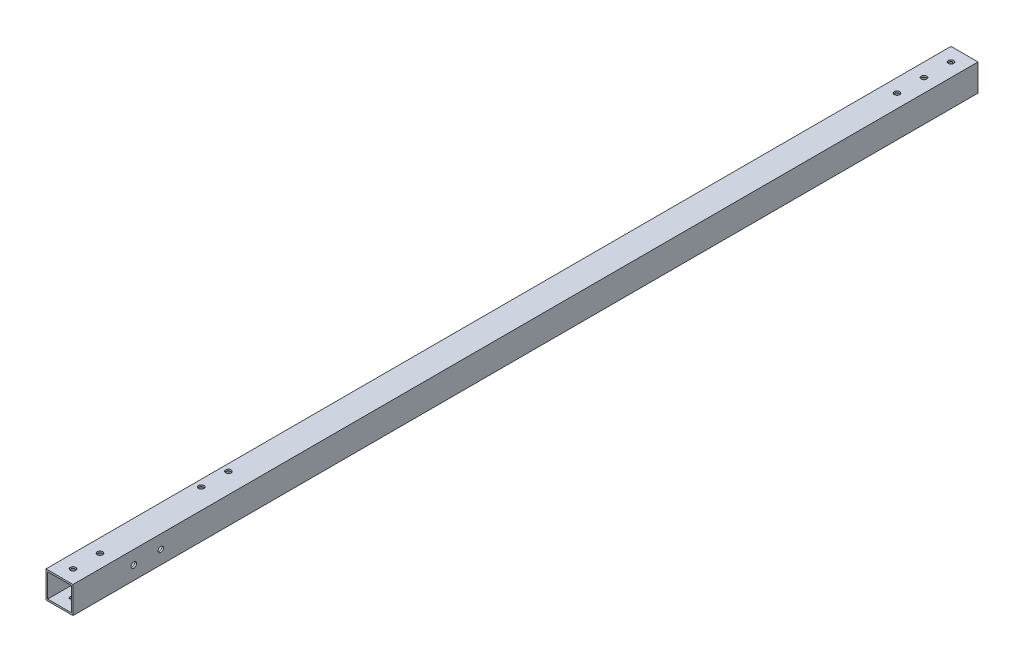
ISO-10303-21;
HEADER;
FILE_DESCRIPTION(('STEP AP214'),'2;1');
FILE_NAME('part.step','',(''),(''),'','','');
FILE_SCHEMA(('AUTOMOTIVE_DESIGN { 1 0 10303 214 1 1 1 1 }'));
ENDSEC;
DATA;
#1=APPLICATION_CONTEXT('core data for automotive mechanical design processes');
#2=APPLICATION_PROTOCOL_DEFINITION('international standard','automotive_design',2000,#1);
#3=PRODUCT_CONTEXT('',#1,'mechanical');
#4=PRODUCT('Part','Part','',(#3));
#5=PRODUCT_RELATED_PRODUCT_CATEGORY('part','',(#4));
#6=PRODUCT_DEFINITION_FORMATION('','',#4);
#7=PRODUCT_DEFINITION_CONTEXT('part definition',#1,'design');
#8=PRODUCT_DEFINITION('design','',#6,#7);
#9=PRODUCT_DEFINITION_SHAPE('','',#8);
#10=(LENGTH_UNIT() NAMED_UNIT(*) SI_UNIT(.MILLI.,.METRE.));
#11=(NAMED_UNIT(*) PLANE_ANGLE_UNIT() SI_UNIT($,.RADIAN.));
#12=(NAMED_UNIT(*) SI_UNIT($,.STERADIAN.) SOLID_ANGLE_UNIT());
#13=UNCERTAINTY_MEASURE_WITH_UNIT(LENGTH_MEASURE(1.E-05),#10,'distance_accuracy_value','');
#14=(GEOMETRIC_REPRESENTATION_CONTEXT(3) GLOBAL_UNCERTAINTY_ASSIGNED_CONTEXT((#13)) GLOBAL_UNIT_ASSIGNED_CONTEXT((#10,
#11,#12)) REPRESENTATION_CONTEXT('',''));
#15=CARTESIAN_POINT('',(0.,0.,0.));
#16=DIRECTION('',(0.,0.,1.));
#17=DIRECTION('',(1.,0.,0.));
#18=AXIS2_PLACEMENT_3D('',#15,#16,#17);
#19=CARTESIAN_POINT('',(0.,0.,850.9));
#20=DIRECTION('',(0.,0.,-1.));
#21=DIRECTION('',(-1.,0.,0.));
#22=AXIS2_PLACEMENT_3D('',#19,#20,#21);
#23=PLANE('',#22);
#24=DIRECTION('',(0.,-1.,0.));
#25=VECTOR('',#24,1.);
#26=CARTESIAN_POINT('',(0.,0.,850.9));
#27=LINE('',#26,#25);
#28=CARTESIAN_POINT('',(0.,25.4,850.9));
#29=VERTEX_POINT('',#28);
#30=CARTESIAN_POINT('',(0.,0.,850.9));
#31=VERTEX_POINT('',#30);
#32=EDGE_CURVE('E157',#29,#31,#27,.T.);
#33=ORIENTED_EDGE('',*,*,#32,.T.);
#34=DIRECTION('',(1.,0.,0.));
#35=VECTOR('',#34,1.);
#36=CARTESIAN_POINT('',(0.,0.,850.9));
#37=LINE('',#36,#35);
#38=CARTESIAN_POINT('',(25.4,0.,850.9));
#39=VERTEX_POINT('',#38);
#40=EDGE_CURVE('E161',#31,#39,#37,.T.);
#41=ORIENTED_EDGE('',*,*,#40,.T.);
#42=DIRECTION('',(0.,1.,0.));
#43=VECTOR('',#42,1.);
#44=CARTESIAN_POINT('',(25.4,0.,850.9));
#45=LINE('',#44,#43);
#46=CARTESIAN_POINT('',(25.4,25.4,850.9));
#47=VERTEX_POINT('',#46);
#48=EDGE_CURVE('E165',#39,#47,#45,.T.);
#49=ORIENTED_EDGE('',*,*,#48,.T.);
#50=DIRECTION('',(-1.,0.,0.));
#51=VECTOR('',#50,1.);
#52=CARTESIAN_POINT('',(0.,25.4,850.9));
#53=LINE('',#52,#51);
#54=EDGE_CURVE('E168',#47,#29,#53,.T.);
#55=ORIENTED_EDGE('',*,*,#54,.T.);
#56=EDGE_LOOP('',(#33,#41,#49,#55));
#57=FACE_BOUND('',#56,.T.);
#58=DIRECTION('',(0.,-1.,0.));
#59=VECTOR('',#58,1.);
#60=CARTESIAN_POINT('',(1.5875,1.5875,850.9));
#61=LINE('',#60,#59);
#62=CARTESIAN_POINT('',(1.5875,23.8125,850.9));
#63=VERTEX_POINT('',#62);
#64=CARTESIAN_POINT('',(1.5875,1.5875,850.9));
#65=VERTEX_POINT('',#64);
#66=EDGE_CURVE('E107',#63,#65,#61,.T.);
#67=ORIENTED_EDGE('',*,*,#66,.F.);
#68=DIRECTION('',(-1.,0.,0.));
#69=VECTOR('',#68,1.);
#70=CARTESIAN_POINT('',(1.5875,23.8125,850.9));
#71=LINE('',#70,#69);
#72=CARTESIAN_POINT('',(23.8125,23.8125,850.9));
#73=VERTEX_POINT('',#72);
#74=EDGE_CURVE('E133',#73,#63,#71,.T.);
#75=ORIENTED_EDGE('',*,*,#74,.F.);
#76=DIRECTION('',(0.,1.,0.));
#77=VECTOR('',#76,1.);
#78=CARTESIAN_POINT('',(23.8125,1.5875,850.9));
#79=LINE('',#78,#77);
#80=CARTESIAN_POINT('',(23.8125,1.5875,850.9));
#81=VERTEX_POINT('',#80);
#82=EDGE_CURVE('E129',#81,#73,#79,.T.);
#83=ORIENTED_EDGE('',*,*,#82,.F.);
#84=DIRECTION('',(1.,0.,0.));
#85=VECTOR('',#84,1.);
#86=CARTESIAN_POINT('',(1.5875,1.5875,850.9));
#87=LINE('',#86,#85);
#88=EDGE_CURVE('E116',#65,#81,#87,.T.);
#89=ORIENTED_EDGE('',*,*,#88,.F.);
#90=EDGE_LOOP('',(#67,#75,#83,#89));
#91=FACE_BOUND('',#90,.T.);
#92=ADVANCED_FACE('F39',(#57,#91),#23,.F.);
#93=CARTESIAN_POINT('',(0.,0.,0.));
#94=DIRECTION('',(0.,0.,-1.));
#95=DIRECTION('',(-1.,0.,0.));
#96=AXIS2_PLACEMENT_3D('',#93,#94,#95);
#97=PLANE('',#96);
#98=DIRECTION('',(0.,-1.,0.));
#99=VECTOR('',#98,1.);
#100=CARTESIAN_POINT('',(0.,0.,0.));
#101=LINE('',#100,#99);
#102=CARTESIAN_POINT('',(0.,25.4,0.));
#103=VERTEX_POINT('',#102);
#104=CARTESIAN_POINT('',(0.,0.,0.));
#105=VERTEX_POINT('',#104);
#106=EDGE_CURVE('E125',#103,#105,#101,.T.);
#107=ORIENTED_EDGE('',*,*,#106,.F.);
#108=DIRECTION('',(-1.,0.,0.));
#109=VECTOR('',#108,1.);
#110=CARTESIAN_POINT('',(0.,25.4,0.));
#111=LINE('',#110,#109);
#112=CARTESIAN_POINT('',(25.4,25.4,0.));
#113=VERTEX_POINT('',#112);
#114=EDGE_CURVE('E162',#113,#103,#111,.T.);
#115=ORIENTED_EDGE('',*,*,#114,.F.);
#116=DIRECTION('',(0.,1.,0.));
#117=VECTOR('',#116,1.);
#118=CARTESIAN_POINT('',(25.4,0.,0.));
#119=LINE('',#118,#117);
#120=CARTESIAN_POINT('',(25.4,0.,0.));
#121=VERTEX_POINT('',#120);
#122=EDGE_CURVE('E178',#121,#113,#119,.T.);
#123=ORIENTED_EDGE('',*,*,#122,.F.);
#124=DIRECTION('',(1.,0.,0.));
#125=VECTOR('',#124,1.);
#126=CARTESIAN_POINT('',(0.,0.,0.));
#127=LINE('',#126,#125);
#128=EDGE_CURVE('E175',#105,#121,#127,.T.);
#129=ORIENTED_EDGE('',*,*,#128,.F.);
#130=EDGE_LOOP('',(#107,#115,#123,#129));
#131=FACE_BOUND('',#130,.T.);
#132=DIRECTION('',(-1.,0.,0.));
#133=VECTOR('',#132,1.);
#134=CARTESIAN_POINT('',(1.5875,23.8125,0.));
#135=LINE('',#134,#133);
#136=CARTESIAN_POINT('',(23.8125,23.8125,0.));
#137=VERTEX_POINT('',#136);
#138=CARTESIAN_POINT('',(1.5875,23.8125,0.));
#139=VERTEX_POINT('',#138);
#140=EDGE_CURVE('E117',#137,#139,#135,.T.);
#141=ORIENTED_EDGE('',*,*,#140,.T.);
#142=DIRECTION('',(0.,-1.,0.));
#143=VECTOR('',#142,1.);
#144=CARTESIAN_POINT('',(1.5875,1.5875,0.));
#145=LINE('',#144,#143);
#146=CARTESIAN_POINT('',(1.5875,1.5875,0.));
#147=VERTEX_POINT('',#146);
#148=EDGE_CURVE('E65',#139,#147,#145,.T.);
#149=ORIENTED_EDGE('',*,*,#148,.T.);
#150=DIRECTION('',(1.,0.,0.));
#151=VECTOR('',#150,1.);
#152=CARTESIAN_POINT('',(1.5875,1.5875,0.));
#153=LINE('',#152,#151);
#154=CARTESIAN_POINT('',(23.8125,1.5875,0.));
#155=VERTEX_POINT('',#154);
#156=EDGE_CURVE('E123',#147,#155,#153,.T.);
#157=ORIENTED_EDGE('',*,*,#156,.T.);
#158=DIRECTION('',(0.,1.,0.));
#159=VECTOR('',#158,1.);
#160=CARTESIAN_POINT('',(23.8125,1.5875,0.));
#161=LINE('',#160,#159);
#162=EDGE_CURVE('E144',#155,#137,#161,.T.);
#163=ORIENTED_EDGE('',*,*,#162,.T.);
#164=EDGE_LOOP('',(#141,#149,#157,#163));
#165=FACE_BOUND('',#164,.T.);
#166=ADVANCED_FACE('F377',(#131,#165),#97,.T.);
#167=CARTESIAN_POINT('',(0.,0.,850.9));
#168=DIRECTION('',(1.,0.,0.));
#169=DIRECTION('',(0.,0.,-1.));
#170=AXIS2_PLACEMENT_3D('',#167,#168,#169);
#171=PLANE('',#170);
#172=CARTESIAN_POINT('',(0.,12.7,793.75));
#173=DIRECTION('',(1.,0.,0.));
#174=DIRECTION('',(0.,0.,-1.));
#175=AXIS2_PLACEMENT_3D('',#172,#173,#174);
#176=CIRCLE('',#175,2.53999999999996);
#177=CARTESIAN_POINT('',(0.,12.7,791.21));
#178=VERTEX_POINT('',#177);
#179=EDGE_CURVE('E231',#178,#178,#176,.T.);
#180=ORIENTED_EDGE('',*,*,#179,.T.);
#181=EDGE_LOOP('',(#180));
#182=FACE_BOUND('',#181,.T.);
#183=CARTESIAN_POINT('',(0.,12.7,768.35));
#184=DIRECTION('',(1.,0.,0.));
#185=DIRECTION('',(0.,0.,-1.));
#186=AXIS2_PLACEMENT_3D('',#183,#184,#185);
#187=CIRCLE('',#186,2.53999999999996);
#188=CARTESIAN_POINT('',(0.,12.7,765.81));
#189=VERTEX_POINT('',#188);
#190=EDGE_CURVE('E245',#189,#189,#187,.T.);
#191=ORIENTED_EDGE('',*,*,#190,.T.);
#192=EDGE_LOOP('',(#191));
#193=FACE_BOUND('',#192,.T.);
#194=ORIENTED_EDGE('',*,*,#106,.T.);
#195=DIRECTION('',(0.,0.,-1.));
#196=VECTOR('',#195,1.);
#197=CARTESIAN_POINT('',(0.,0.,850.9));
#198=LINE('',#197,#196);
#199=EDGE_CURVE('E11',#31,#105,#198,.T.);
#200=ORIENTED_EDGE('',*,*,#199,.F.);
#201=ORIENTED_EDGE('',*,*,#32,.F.);
#202=DIRECTION('',(0.,0.,-1.));
#203=VECTOR('',#202,1.);
#204=CARTESIAN_POINT('',(0.,25.4,850.9));
#205=LINE('',#204,#203);
#206=EDGE_CURVE('E171',#29,#103,#205,.T.);
#207=ORIENTED_EDGE('',*,*,#206,.T.);
#208=EDGE_LOOP('',(#194,#200,#201,#207));
#209=FACE_BOUND('',#208,.T.);
#210=ADVANCED_FACE('F41',(#182,#193,#209),#171,.F.);
#211=CARTESIAN_POINT('',(0.,0.,850.9));
#212=DIRECTION('',(0.,1.,0.));
#213=DIRECTION('',(0.,0.,1.));
#214=AXIS2_PLACEMENT_3D('',#211,#212,#213);
#215=PLANE('',#214);
#216=CARTESIAN_POINT('',(6.35,0.,685.8));
#217=DIRECTION('',(0.,1.,0.));
#218=DIRECTION('',(0.,0.,1.));
#219=AXIS2_PLACEMENT_3D('',#216,#217,#218);
#220=CIRCLE('',#219,2.53999999999989);
#221=CARTESIAN_POINT('',(6.35,0.,688.34));
#222=VERTEX_POINT('',#221);
#223=EDGE_CURVE('E301',#222,#222,#220,.T.);
#224=ORIENTED_EDGE('',*,*,#223,.T.);
#225=EDGE_LOOP('',(#224));
#226=FACE_BOUND('',#225,.T.);
#227=CARTESIAN_POINT('',(6.35,0.,711.2));
#228=DIRECTION('',(0.,1.,0.));
#229=DIRECTION('',(0.,0.,1.));
#230=AXIS2_PLACEMENT_3D('',#227,#228,#229);
#231=CIRCLE('',#230,2.5399999999999);
#232=CARTESIAN_POINT('',(6.35,0.,713.74));
#233=VERTEX_POINT('',#232);
#234=EDGE_CURVE('E293',#233,#233,#231,.T.);
#235=ORIENTED_EDGE('',*,*,#234,.T.);
#236=EDGE_LOOP('',(#235));
#237=FACE_BOUND('',#236,.T.);
#238=CARTESIAN_POINT('',(12.7,0.,838.2));
#239=DIRECTION('',(0.,1.,0.));
#240=DIRECTION('',(0.,0.,-1.));
#241=AXIS2_PLACEMENT_3D('',#238,#239,#240);
#242=CIRCLE('',#241,2.53999999999991);
#243=CARTESIAN_POINT('',(12.7,0.,835.66));
#244=VERTEX_POINT('',#243);
#245=EDGE_CURVE('E285',#244,#244,#242,.T.);
#246=ORIENTED_EDGE('',*,*,#245,.T.);
#247=EDGE_LOOP('',(#246));
#248=FACE_BOUND('',#247,.T.);
#249=CARTESIAN_POINT('',(12.7,0.,63.5));
#250=DIRECTION('',(0.,1.,0.));
#251=DIRECTION('',(0.,0.,1.));
#252=AXIS2_PLACEMENT_3D('',#249,#250,#251);
#253=CIRCLE('',#252,2.54);
#254=CARTESIAN_POINT('',(12.7,0.,66.04));
#255=VERTEX_POINT('',#254);
#256=EDGE_CURVE('E277',#255,#255,#253,.T.);
#257=ORIENTED_EDGE('',*,*,#256,.T.);
#258=EDGE_LOOP('',(#257));
#259=FACE_BOUND('',#258,.T.);
#260=CARTESIAN_POINT('',(12.7,0.,38.1));
#261=DIRECTION('',(0.,1.,0.));
#262=DIRECTION('',(0.,0.,1.));
#263=AXIS2_PLACEMENT_3D('',#260,#261,#262);
#264=CIRCLE('',#263,2.54);
#265=CARTESIAN_POINT('',(12.7,0.,40.64));
#266=VERTEX_POINT('',#265);
#267=EDGE_CURVE('E269',#266,#266,#264,.T.);
#268=ORIENTED_EDGE('',*,*,#267,.T.);
#269=EDGE_LOOP('',(#268));
#270=FACE_BOUND('',#269,.T.);
#271=CARTESIAN_POINT('',(12.7,0.,12.7));
#272=DIRECTION('',(0.,1.,0.));
#273=DIRECTION('',(0.,0.,1.));
#274=AXIS2_PLACEMENT_3D('',#271,#272,#273);
#275=CIRCLE('',#274,2.54);
#276=CARTESIAN_POINT('',(12.7,0.,15.24));
#277=VERTEX_POINT('',#276);
#278=EDGE_CURVE('E260',#277,#277,#275,.T.);
#279=ORIENTED_EDGE('',*,*,#278,.T.);
#280=EDGE_LOOP('',(#279));
#281=FACE_BOUND('',#280,.T.);
#282=CARTESIAN_POINT('',(12.7,0.,812.8));
#283=DIRECTION('',(0.,1.,0.));
#284=DIRECTION('',(0.,0.,-1.));
#285=AXIS2_PLACEMENT_3D('',#282,#283,#284);
#286=CIRCLE('',#285,2.5399999999999);
#287=CARTESIAN_POINT('',(12.7,0.,810.26));
#288=VERTEX_POINT('',#287);
#289=EDGE_CURVE('E198',#288,#288,#286,.T.);
#290=ORIENTED_EDGE('',*,*,#289,.T.);
#291=EDGE_LOOP('',(#290));
#292=FACE_BOUND('',#291,.T.);
#293=ORIENTED_EDGE('',*,*,#128,.T.);
#294=DIRECTION('',(0.,0.,-1.));
#295=VECTOR('',#294,1.);
#296=CARTESIAN_POINT('',(25.4,0.,850.9));
#297=LINE('',#296,#295);
#298=EDGE_CURVE('E49',#39,#121,#297,.T.);
#299=ORIENTED_EDGE('',*,*,#298,.F.);
#300=ORIENTED_EDGE('',*,*,#40,.F.);
#301=ORIENTED_EDGE('',*,*,#199,.T.);
#302=EDGE_LOOP('',(#293,#299,#300,#301));
#303=FACE_BOUND('',#302,.T.);
#304=ADVANCED_FACE('F363',(#226,#237,#248,#259,#270,#281,#292,#303),#215,.F.);
#305=CARTESIAN_POINT('',(25.4,0.,850.9));
#306=DIRECTION('',(-1.,0.,0.));
#307=DIRECTION('',(0.,0.,1.));
#308=AXIS2_PLACEMENT_3D('',#305,#306,#307);
#309=PLANE('',#308);
#310=CARTESIAN_POINT('',(25.4,12.7,793.75));
#311=DIRECTION('',(1.,0.,0.));
#312=DIRECTION('',(0.,0.,-1.));
#313=AXIS2_PLACEMENT_3D('',#310,#311,#312);
#314=CIRCLE('',#313,2.53999999999996);
#315=CARTESIAN_POINT('',(25.4,12.7,791.21));
#316=VERTEX_POINT('',#315);
#317=EDGE_CURVE('E239',#316,#316,#314,.T.);
#318=ORIENTED_EDGE('',*,*,#317,.F.);
#319=EDGE_LOOP('',(#318));
#320=FACE_BOUND('',#319,.T.);
#321=CARTESIAN_POINT('',(25.4,12.7,768.35));
#322=DIRECTION('',(1.,0.,0.));
#323=DIRECTION('',(0.,0.,-1.));
#324=AXIS2_PLACEMENT_3D('',#321,#322,#323);
#325=CIRCLE('',#324,2.53999999999996);
#326=CARTESIAN_POINT('',(25.4,12.7,765.81));
#327=VERTEX_POINT('',#326);
#328=EDGE_CURVE('E251',#327,#327,#325,.T.);
#329=ORIENTED_EDGE('',*,*,#328,.F.);
#330=EDGE_LOOP('',(#329));
#331=FACE_BOUND('',#330,.T.);
#332=ORIENTED_EDGE('',*,*,#122,.T.);
#333=DIRECTION('',(0.,0.,-1.));
#334=VECTOR('',#333,1.);
#335=CARTESIAN_POINT('',(25.4,25.4,850.9));
#336=LINE('',#335,#334);
#337=EDGE_CURVE('E186',#47,#113,#336,.T.);
#338=ORIENTED_EDGE('',*,*,#337,.F.);
#339=ORIENTED_EDGE('',*,*,#48,.F.);
#340=ORIENTED_EDGE('',*,*,#298,.T.);
#341=EDGE_LOOP('',(#332,#338,#339,#340));
#342=FACE_BOUND('',#341,.T.);
#343=ADVANCED_FACE('F366',(#320,#331,#342),#309,.F.);
#344=CARTESIAN_POINT('',(0.,25.4,850.9));
#345=DIRECTION('',(0.,-1.,0.));
#346=DIRECTION('',(0.,0.,-1.));
#347=AXIS2_PLACEMENT_3D('',#344,#345,#346);
#348=PLANE('',#347);
#349=CARTESIAN_POINT('',(6.35,25.4,685.8));
#350=DIRECTION('',(0.,1.,0.));
#351=DIRECTION('',(0.,0.,1.));
#352=AXIS2_PLACEMENT_3D('',#349,#350,#351);
#353=CIRCLE('',#352,2.53999999999989);
#354=CARTESIAN_POINT('',(6.35,25.4,688.34));
#355=VERTEX_POINT('',#354);
#356=EDGE_CURVE('E259',#355,#355,#353,.T.);
#357=ORIENTED_EDGE('',*,*,#356,.F.);
#358=EDGE_LOOP('',(#357));
#359=FACE_BOUND('',#358,.T.);
#360=CARTESIAN_POINT('',(6.35,25.4,711.2));
#361=DIRECTION('',(0.,1.,0.));
#362=DIRECTION('',(0.,0.,1.));
#363=AXIS2_PLACEMENT_3D('',#360,#361,#362);
#364=CIRCLE('',#363,2.5399999999999);
#365=CARTESIAN_POINT('',(6.35,25.4,713.74));
#366=VERTEX_POINT('',#365);
#367=EDGE_CURVE('E297',#366,#366,#364,.T.);
#368=ORIENTED_EDGE('',*,*,#367,.F.);
#369=EDGE_LOOP('',(#368));
#370=FACE_BOUND('',#369,.T.);
#371=CARTESIAN_POINT('',(12.7,25.4,838.2));
#372=DIRECTION('',(0.,1.,0.));
#373=DIRECTION('',(0.,0.,-1.));
#374=AXIS2_PLACEMENT_3D('',#371,#372,#373);
#375=CIRCLE('',#374,2.53999999999991);
#376=CARTESIAN_POINT('',(12.7,25.4,835.66));
#377=VERTEX_POINT('',#376);
#378=EDGE_CURVE('E289',#377,#377,#375,.T.);
#379=ORIENTED_EDGE('',*,*,#378,.F.);
#380=EDGE_LOOP('',(#379));
#381=FACE_BOUND('',#380,.T.);
#382=CARTESIAN_POINT('',(12.7,25.4,63.5));
#383=DIRECTION('',(0.,1.,0.));
#384=DIRECTION('',(0.,0.,1.));
#385=AXIS2_PLACEMENT_3D('',#382,#383,#384);
#386=CIRCLE('',#385,2.54);
#387=CARTESIAN_POINT('',(12.7,25.4,66.04));
#388=VERTEX_POINT('',#387);
#389=EDGE_CURVE('E281',#388,#388,#386,.T.);
#390=ORIENTED_EDGE('',*,*,#389,.F.);
#391=EDGE_LOOP('',(#390));
#392=FACE_BOUND('',#391,.T.);
#393=CARTESIAN_POINT('',(12.7,25.4,38.1));
#394=DIRECTION('',(0.,1.,0.));
#395=DIRECTION('',(0.,0.,1.));
#396=AXIS2_PLACEMENT_3D('',#393,#394,#395);
#397=CIRCLE('',#396,2.54);
#398=CARTESIAN_POINT('',(12.7,25.4,40.64));
#399=VERTEX_POINT('',#398);
#400=EDGE_CURVE('E273',#399,#399,#397,.T.);
#401=ORIENTED_EDGE('',*,*,#400,.F.);
#402=EDGE_LOOP('',(#401));
#403=FACE_BOUND('',#402,.T.);
#404=CARTESIAN_POINT('',(12.7,25.4,12.7));
#405=DIRECTION('',(0.,1.,0.));
#406=DIRECTION('',(0.,0.,1.));
#407=AXIS2_PLACEMENT_3D('',#404,#405,#406);
#408=CIRCLE('',#407,2.54);
#409=CARTESIAN_POINT('',(12.7,25.4,15.24));
#410=VERTEX_POINT('',#409);
#411=EDGE_CURVE('E265',#410,#410,#408,.T.);
#412=ORIENTED_EDGE('',*,*,#411,.F.);
#413=EDGE_LOOP('',(#412));
#414=FACE_BOUND('',#413,.T.);
#415=CARTESIAN_POINT('',(12.7,25.4,812.8));
#416=DIRECTION('',(0.,1.,0.));
#417=DIRECTION('',(0.,0.,-1.));
#418=AXIS2_PLACEMENT_3D('',#415,#416,#417);
#419=CIRCLE('',#418,2.5399999999999);
#420=CARTESIAN_POINT('',(12.7,25.4,810.26));
#421=VERTEX_POINT('',#420);
#422=EDGE_CURVE('E264',#421,#421,#419,.T.);
#423=ORIENTED_EDGE('',*,*,#422,.F.);
#424=EDGE_LOOP('',(#423));
#425=FACE_BOUND('',#424,.T.);
#426=ORIENTED_EDGE('',*,*,#114,.T.);
#427=ORIENTED_EDGE('',*,*,#206,.F.);
#428=ORIENTED_EDGE('',*,*,#54,.F.);
#429=ORIENTED_EDGE('',*,*,#337,.T.);
#430=EDGE_LOOP('',(#426,#427,#428,#429));
#431=FACE_BOUND('',#430,.T.);
#432=ADVANCED_FACE('F381',(#359,#370,#381,#392,#403,#414,#425,#431),#348,.F.);
#433=CARTESIAN_POINT('',(1.5875,1.5875,850.9));
#434=DIRECTION('',(1.,0.,0.));
#435=DIRECTION('',(0.,0.,-1.));
#436=AXIS2_PLACEMENT_3D('',#433,#434,#435);
#437=PLANE('',#436);
#438=CARTESIAN_POINT('',(1.5875,12.7,793.75));
#439=DIRECTION('',(1.,0.,0.));
#440=DIRECTION('',(0.,0.,-1.));
#441=AXIS2_PLACEMENT_3D('',#438,#439,#440);
#442=CIRCLE('',#441,2.53999999999996);
#443=CARTESIAN_POINT('',(1.5875,12.7,791.21));
#444=VERTEX_POINT('',#443);
#445=EDGE_CURVE('E255',#444,#444,#442,.T.);
#446=ORIENTED_EDGE('',*,*,#445,.F.);
#447=EDGE_LOOP('',(#446));
#448=FACE_BOUND('',#447,.T.);
#449=CARTESIAN_POINT('',(1.5875,12.7,768.35));
#450=DIRECTION('',(1.,0.,0.));
#451=DIRECTION('',(0.,0.,-1.));
#452=AXIS2_PLACEMENT_3D('',#449,#450,#451);
#453=CIRCLE('',#452,2.53999999999996);
#454=CARTESIAN_POINT('',(1.5875,12.7,765.81));
#455=VERTEX_POINT('',#454);
#456=EDGE_CURVE('E230',#455,#455,#453,.T.);
#457=ORIENTED_EDGE('',*,*,#456,.F.);
#458=EDGE_LOOP('',(#457));
#459=FACE_BOUND('',#458,.T.);
#460=ORIENTED_EDGE('',*,*,#148,.F.);
#461=DIRECTION('',(0.,0.,-1.));
#462=VECTOR('',#461,1.);
#463=CARTESIAN_POINT('',(1.5875,23.8125,850.9));
#464=LINE('',#463,#462);
#465=EDGE_CURVE('E111',#63,#139,#464,.T.);
#466=ORIENTED_EDGE('',*,*,#465,.F.);
#467=ORIENTED_EDGE('',*,*,#66,.T.);
#468=DIRECTION('',(0.,0.,-1.));
#469=VECTOR('',#468,1.);
#470=CARTESIAN_POINT('',(1.5875,1.5875,850.9));
#471=LINE('',#470,#469);
#472=EDGE_CURVE('E110',#65,#147,#471,.T.);
#473=ORIENTED_EDGE('',*,*,#472,.T.);
#474=EDGE_LOOP('',(#460,#466,#467,#473));
#475=FACE_BOUND('',#474,.T.);
#476=ADVANCED_FACE('F109',(#448,#459,#475),#437,.T.);
#477=CARTESIAN_POINT('',(1.5875,1.5875,850.9));
#478=DIRECTION('',(0.,1.,0.));
#479=DIRECTION('',(0.,0.,1.));
#480=AXIS2_PLACEMENT_3D('',#477,#478,#479);
#481=PLANE('',#480);
#482=CARTESIAN_POINT('',(6.35,1.5875,685.8));
#483=DIRECTION('',(0.,1.,0.));
#484=DIRECTION('',(0.,0.,1.));
#485=AXIS2_PLACEMENT_3D('',#482,#483,#484);
#486=CIRCLE('',#485,2.53999999999989);
#487=CARTESIAN_POINT('',(6.35,1.5875,688.34));
#488=VERTEX_POINT('',#487);
#489=EDGE_CURVE('E141',#488,#488,#486,.T.);
#490=ORIENTED_EDGE('',*,*,#489,.F.);
#491=EDGE_LOOP('',(#490));
#492=FACE_BOUND('',#491,.T.);
#493=CARTESIAN_POINT('',(6.35,1.5875,711.2));
#494=DIRECTION('',(0.,1.,0.));
#495=DIRECTION('',(0.,0.,1.));
#496=AXIS2_PLACEMENT_3D('',#493,#494,#495);
#497=CIRCLE('',#496,2.5399999999999);
#498=CARTESIAN_POINT('',(6.35,1.5875,713.74));
#499=VERTEX_POINT('',#498);
#500=EDGE_CURVE('E223',#499,#499,#497,.T.);
#501=ORIENTED_EDGE('',*,*,#500,.F.);
#502=EDGE_LOOP('',(#501));
#503=FACE_BOUND('',#502,.T.);
#504=CARTESIAN_POINT('',(12.7,1.5875,838.2));
#505=DIRECTION('',(0.,1.,0.));
#506=DIRECTION('',(0.,0.,1.));
#507=AXIS2_PLACEMENT_3D('',#504,#505,#506);
#508=CIRCLE('',#507,2.53999999999991);
#509=CARTESIAN_POINT('',(12.7,1.5875,840.74));
#510=VERTEX_POINT('',#509);
#511=EDGE_CURVE('E218',#510,#510,#508,.T.);
#512=ORIENTED_EDGE('',*,*,#511,.F.);
#513=EDGE_LOOP('',(#512));
#514=FACE_BOUND('',#513,.T.);
#515=CARTESIAN_POINT('',(12.7,1.5875,63.5));
#516=DIRECTION('',(0.,1.,0.));
#517=DIRECTION('',(0.,0.,1.));
#518=AXIS2_PLACEMENT_3D('',#515,#516,#517);
#519=CIRCLE('',#518,2.54);
#520=CARTESIAN_POINT('',(12.7,1.5875,66.04));
#521=VERTEX_POINT('',#520);
#522=EDGE_CURVE('E213',#521,#521,#519,.T.);
#523=ORIENTED_EDGE('',*,*,#522,.F.);
#524=EDGE_LOOP('',(#523));
#525=FACE_BOUND('',#524,.T.);
#526=CARTESIAN_POINT('',(12.7,1.5875,38.1));
#527=DIRECTION('',(0.,1.,0.));
#528=DIRECTION('',(0.,0.,1.));
#529=AXIS2_PLACEMENT_3D('',#526,#527,#528);
#530=CIRCLE('',#529,2.54);
#531=CARTESIAN_POINT('',(12.7,1.5875,40.64));
#532=VERTEX_POINT('',#531);
#533=EDGE_CURVE('E208',#532,#532,#530,.T.);
#534=ORIENTED_EDGE('',*,*,#533,.F.);
#535=EDGE_LOOP('',(#534));
#536=FACE_BOUND('',#535,.T.);
#537=CARTESIAN_POINT('',(12.7,1.5875,12.7));
#538=DIRECTION('',(0.,1.,0.));
#539=DIRECTION('',(0.,0.,1.));
#540=AXIS2_PLACEMENT_3D('',#537,#538,#539);
#541=CIRCLE('',#540,2.54);
#542=CARTESIAN_POINT('',(12.7,1.5875,15.24));
#543=VERTEX_POINT('',#542);
#544=EDGE_CURVE('E203',#543,#543,#541,.T.);
#545=ORIENTED_EDGE('',*,*,#544,.F.);
#546=EDGE_LOOP('',(#545));
#547=FACE_BOUND('',#546,.T.);
#548=CARTESIAN_POINT('',(12.7,1.5875,812.8));
#549=DIRECTION('',(0.,1.,0.));
#550=DIRECTION('',(0.,0.,1.));
#551=AXIS2_PLACEMENT_3D('',#548,#549,#550);
#552=CIRCLE('',#551,2.5399999999999);
#553=CARTESIAN_POINT('',(12.7,1.5875,815.34));
#554=VERTEX_POINT('',#553);
#555=EDGE_CURVE('E197',#554,#554,#552,.T.);
#556=ORIENTED_EDGE('',*,*,#555,.F.);
#557=EDGE_LOOP('',(#556));
#558=FACE_BOUND('',#557,.T.);
#559=ORIENTED_EDGE('',*,*,#156,.F.);
#560=ORIENTED_EDGE('',*,*,#472,.F.);
#561=ORIENTED_EDGE('',*,*,#88,.T.);
#562=DIRECTION('',(0.,0.,-1.));
#563=VECTOR('',#562,1.);
#564=CARTESIAN_POINT('',(23.8125,1.5875,850.9));
#565=LINE('',#564,#563);
#566=EDGE_CURVE('E126',#81,#155,#565,.T.);
#567=ORIENTED_EDGE('',*,*,#566,.T.);
#568=EDGE_LOOP('',(#559,#560,#561,#567));
#569=FACE_BOUND('',#568,.T.);
#570=ADVANCED_FACE('F120',(#492,#503,#514,#525,#536,#547,#558,#569),#481,.T.);
#571=CARTESIAN_POINT('',(23.8125,1.5875,850.9));
#572=DIRECTION('',(-1.,0.,0.));
#573=DIRECTION('',(0.,0.,1.));
#574=AXIS2_PLACEMENT_3D('',#571,#572,#573);
#575=PLANE('',#574);
#576=CARTESIAN_POINT('',(23.8125,12.7,793.75));
#577=DIRECTION('',(-1.,0.,0.));
#578=DIRECTION('',(0.,0.,1.));
#579=AXIS2_PLACEMENT_3D('',#576,#577,#578);
#580=CIRCLE('',#579,2.53999999999996);
#581=CARTESIAN_POINT('',(23.8125,12.7,796.29));
#582=VERTEX_POINT('',#581);
#583=EDGE_CURVE('E43',#582,#582,#580,.T.);
#584=ORIENTED_EDGE('',*,*,#583,.F.);
#585=EDGE_LOOP('',(#584));
#586=FACE_BOUND('',#585,.T.);
#587=CARTESIAN_POINT('',(23.8125,12.7,768.35));
#588=DIRECTION('',(-1.,0.,0.));
#589=DIRECTION('',(0.,0.,1.));
#590=AXIS2_PLACEMENT_3D('',#587,#588,#589);
#591=CIRCLE('',#590,2.53999999999996);
#592=CARTESIAN_POINT('',(23.8125,12.7,770.89));
#593=VERTEX_POINT('',#592);
#594=EDGE_CURVE('E227',#593,#593,#591,.T.);
#595=ORIENTED_EDGE('',*,*,#594,.F.);
#596=EDGE_LOOP('',(#595));
#597=FACE_BOUND('',#596,.T.);
#598=ORIENTED_EDGE('',*,*,#162,.F.);
#599=ORIENTED_EDGE('',*,*,#566,.F.);
#600=ORIENTED_EDGE('',*,*,#82,.T.);
#601=DIRECTION('',(0.,0.,-1.));
#602=VECTOR('',#601,1.);
#603=CARTESIAN_POINT('',(23.8125,23.8125,850.9));
#604=LINE('',#603,#602);
#605=EDGE_CURVE('E57',#73,#137,#604,.T.);
#606=ORIENTED_EDGE('',*,*,#605,.T.);
#607=EDGE_LOOP('',(#598,#599,#600,#606));
#608=FACE_BOUND('',#607,.T.);
#609=ADVANCED_FACE('F340',(#586,#597,#608),#575,.T.);
#610=CARTESIAN_POINT('',(1.5875,23.8125,850.9));
#611=DIRECTION('',(0.,-1.,0.));
#612=DIRECTION('',(0.,0.,-1.));
#613=AXIS2_PLACEMENT_3D('',#610,#611,#612);
#614=PLANE('',#613);
#615=CARTESIAN_POINT('',(6.35,23.8125,685.8));
#616=DIRECTION('',(0.,-1.,0.));
#617=DIRECTION('',(0.,0.,-1.));
#618=AXIS2_PLACEMENT_3D('',#615,#616,#617);
#619=CIRCLE('',#618,2.53999999999989);
#620=CARTESIAN_POINT('',(6.35,23.8125,683.26));
#621=VERTEX_POINT('',#620);
#622=EDGE_CURVE('E224',#621,#621,#619,.T.);
#623=ORIENTED_EDGE('',*,*,#622,.F.);
#624=EDGE_LOOP('',(#623));
#625=FACE_BOUND('',#624,.T.);
#626=CARTESIAN_POINT('',(6.35,23.8125,711.2));
#627=DIRECTION('',(0.,-1.,0.));
#628=DIRECTION('',(0.,0.,-1.));
#629=AXIS2_PLACEMENT_3D('',#626,#627,#628);
#630=CIRCLE('',#629,2.5399999999999);
#631=CARTESIAN_POINT('',(6.35,23.8125,708.66));
#632=VERTEX_POINT('',#631);
#633=EDGE_CURVE('E219',#632,#632,#630,.T.);
#634=ORIENTED_EDGE('',*,*,#633,.F.);
#635=EDGE_LOOP('',(#634));
#636=FACE_BOUND('',#635,.T.);
#637=CARTESIAN_POINT('',(12.7,23.8125,838.2));
#638=DIRECTION('',(0.,-1.,0.));
#639=DIRECTION('',(0.,0.,-1.));
#640=AXIS2_PLACEMENT_3D('',#637,#638,#639);
#641=CIRCLE('',#640,2.53999999999991);
#642=CARTESIAN_POINT('',(12.7,23.8125,835.66));
#643=VERTEX_POINT('',#642);
#644=EDGE_CURVE('E214',#643,#643,#641,.T.);
#645=ORIENTED_EDGE('',*,*,#644,.F.);
#646=EDGE_LOOP('',(#645));
#647=FACE_BOUND('',#646,.T.);
#648=CARTESIAN_POINT('',(12.7,23.8125,63.5));
#649=DIRECTION('',(0.,-1.,0.));
#650=DIRECTION('',(0.,0.,-1.));
#651=AXIS2_PLACEMENT_3D('',#648,#649,#650);
#652=CIRCLE('',#651,2.54);
#653=CARTESIAN_POINT('',(12.7,23.8125,60.96));
#654=VERTEX_POINT('',#653);
#655=EDGE_CURVE('E209',#654,#654,#652,.T.);
#656=ORIENTED_EDGE('',*,*,#655,.F.);
#657=EDGE_LOOP('',(#656));
#658=FACE_BOUND('',#657,.T.);
#659=CARTESIAN_POINT('',(12.7,23.8125,38.1));
#660=DIRECTION('',(0.,-1.,0.));
#661=DIRECTION('',(0.,0.,-1.));
#662=AXIS2_PLACEMENT_3D('',#659,#660,#661);
#663=CIRCLE('',#662,2.54);
#664=CARTESIAN_POINT('',(12.7,23.8125,35.56));
#665=VERTEX_POINT('',#664);
#666=EDGE_CURVE('E204',#665,#665,#663,.T.);
#667=ORIENTED_EDGE('',*,*,#666,.F.);
#668=EDGE_LOOP('',(#667));
#669=FACE_BOUND('',#668,.T.);
#670=CARTESIAN_POINT('',(12.7,23.8125,12.7));
#671=DIRECTION('',(0.,-1.,0.));
#672=DIRECTION('',(0.,0.,-1.));
#673=AXIS2_PLACEMENT_3D('',#670,#671,#672);
#674=CIRCLE('',#673,2.54);
#675=CARTESIAN_POINT('',(12.7,23.8125,10.16));
#676=VERTEX_POINT('',#675);
#677=EDGE_CURVE('E199',#676,#676,#674,.T.);
#678=ORIENTED_EDGE('',*,*,#677,.F.);
#679=EDGE_LOOP('',(#678));
#680=FACE_BOUND('',#679,.T.);
#681=CARTESIAN_POINT('',(12.7,23.8125,812.8));
#682=DIRECTION('',(0.,-1.,0.));
#683=DIRECTION('',(0.,0.,-1.));
#684=AXIS2_PLACEMENT_3D('',#681,#682,#683);
#685=CIRCLE('',#684,2.5399999999999);
#686=CARTESIAN_POINT('',(12.7,23.8125,810.26));
#687=VERTEX_POINT('',#686);
#688=EDGE_CURVE('E193',#687,#687,#685,.T.);
#689=ORIENTED_EDGE('',*,*,#688,.F.);
#690=EDGE_LOOP('',(#689));
#691=FACE_BOUND('',#690,.T.);
#692=ORIENTED_EDGE('',*,*,#140,.F.);
#693=ORIENTED_EDGE('',*,*,#605,.F.);
#694=ORIENTED_EDGE('',*,*,#74,.T.);
#695=ORIENTED_EDGE('',*,*,#465,.T.);
#696=EDGE_LOOP('',(#692,#693,#694,#695));
#697=FACE_BOUND('',#696,.T.);
#698=ADVANCED_FACE('F464',(#625,#636,#647,#658,#669,#680,#691,#697),#614,.T.);
#699=CARTESIAN_POINT('',(12.7,0.,812.8));
#700=DIRECTION('',(0.,1.,0.));
#701=DIRECTION('',(0.,0.,1.));
#702=AXIS2_PLACEMENT_3D('',#699,#700,#701);
#703=CYLINDRICAL_SURFACE('',#702,2.5399999999999);
#704=ORIENTED_EDGE('',*,*,#688,.T.);
#705=EDGE_LOOP('',(#704));
#706=FACE_BOUND('',#705,.T.);
#707=ORIENTED_EDGE('',*,*,#422,.T.);
#708=EDGE_LOOP('',(#707));
#709=FACE_BOUND('',#708,.T.);
#710=ADVANCED_FACE('F360',(#706,#709),#703,.F.);
#711=CARTESIAN_POINT('',(12.7,0.,12.7));
#712=DIRECTION('',(0.,1.,0.));
#713=DIRECTION('',(0.,0.,1.));
#714=AXIS2_PLACEMENT_3D('',#711,#712,#713);
#715=CYLINDRICAL_SURFACE('',#714,2.54);
#716=ORIENTED_EDGE('',*,*,#677,.T.);
#717=EDGE_LOOP('',(#716));
#718=FACE_BOUND('',#717,.T.);
#719=ORIENTED_EDGE('',*,*,#411,.T.);
#720=EDGE_LOOP('',(#719));
#721=FACE_BOUND('',#720,.T.);
#722=ADVANCED_FACE('F478',(#718,#721),#715,.F.);
#723=CARTESIAN_POINT('',(12.7,0.,38.1));
#724=DIRECTION('',(0.,1.,0.));
#725=DIRECTION('',(0.,0.,1.));
#726=AXIS2_PLACEMENT_3D('',#723,#724,#725);
#727=CYLINDRICAL_SURFACE('',#726,2.54);
#728=ORIENTED_EDGE('',*,*,#666,.T.);
#729=EDGE_LOOP('',(#728));
#730=FACE_BOUND('',#729,.T.);
#731=ORIENTED_EDGE('',*,*,#400,.T.);
#732=EDGE_LOOP('',(#731));
#733=FACE_BOUND('',#732,.T.);
#734=ADVANCED_FACE('F487',(#730,#733),#727,.F.);
#735=CARTESIAN_POINT('',(12.7,0.,63.5));
#736=DIRECTION('',(0.,1.,0.));
#737=DIRECTION('',(0.,0.,1.));
#738=AXIS2_PLACEMENT_3D('',#735,#736,#737);
#739=CYLINDRICAL_SURFACE('',#738,2.54);
#740=ORIENTED_EDGE('',*,*,#655,.T.);
#741=EDGE_LOOP('',(#740));
#742=FACE_BOUND('',#741,.T.);
#743=ORIENTED_EDGE('',*,*,#389,.T.);
#744=EDGE_LOOP('',(#743));
#745=FACE_BOUND('',#744,.T.);
#746=ADVANCED_FACE('F496',(#742,#745),#739,.F.);
#747=CARTESIAN_POINT('',(12.7,0.,838.2));
#748=DIRECTION('',(0.,1.,0.));
#749=DIRECTION('',(0.,0.,1.));
#750=AXIS2_PLACEMENT_3D('',#747,#748,#749);
#751=CYLINDRICAL_SURFACE('',#750,2.53999999999991);
#752=ORIENTED_EDGE('',*,*,#644,.T.);
#753=EDGE_LOOP('',(#752));
#754=FACE_BOUND('',#753,.T.);
#755=ORIENTED_EDGE('',*,*,#378,.T.);
#756=EDGE_LOOP('',(#755));
#757=FACE_BOUND('',#756,.T.);
#758=ADVANCED_FACE('F507',(#754,#757),#751,.F.);
#759=CARTESIAN_POINT('',(6.35,0.,711.2));
#760=DIRECTION('',(0.,1.,0.));
#761=DIRECTION('',(0.,0.,1.));
#762=AXIS2_PLACEMENT_3D('',#759,#760,#761);
#763=CYLINDRICAL_SURFACE('',#762,2.5399999999999);
#764=ORIENTED_EDGE('',*,*,#633,.T.);
#765=EDGE_LOOP('',(#764));
#766=FACE_BOUND('',#765,.T.);
#767=ORIENTED_EDGE('',*,*,#367,.T.);
#768=EDGE_LOOP('',(#767));
#769=FACE_BOUND('',#768,.T.);
#770=ADVANCED_FACE('F518',(#766,#769),#763,.F.);
#771=CARTESIAN_POINT('',(6.35,0.,685.8));
#772=DIRECTION('',(0.,1.,0.));
#773=DIRECTION('',(0.,0.,1.));
#774=AXIS2_PLACEMENT_3D('',#771,#772,#773);
#775=CYLINDRICAL_SURFACE('',#774,2.53999999999989);
#776=ORIENTED_EDGE('',*,*,#622,.T.);
#777=EDGE_LOOP('',(#776));
#778=FACE_BOUND('',#777,.T.);
#779=ORIENTED_EDGE('',*,*,#356,.T.);
#780=EDGE_LOOP('',(#779));
#781=FACE_BOUND('',#780,.T.);
#782=ADVANCED_FACE('F358',(#778,#781),#775,.F.);
#783=ORIENTED_EDGE('',*,*,#555,.T.);
#784=EDGE_LOOP('',(#783));
#785=FACE_BOUND('',#784,.T.);
#786=ORIENTED_EDGE('',*,*,#289,.F.);
#787=EDGE_LOOP('',(#786));
#788=FACE_BOUND('',#787,.T.);
#789=ADVANCED_FACE('F354',(#785,#788),#703,.F.);
#790=ORIENTED_EDGE('',*,*,#544,.T.);
#791=EDGE_LOOP('',(#790));
#792=FACE_BOUND('',#791,.T.);
#793=ORIENTED_EDGE('',*,*,#278,.F.);
#794=EDGE_LOOP('',(#793));
#795=FACE_BOUND('',#794,.T.);
#796=ADVANCED_FACE('F357',(#792,#795),#715,.F.);
#797=ORIENTED_EDGE('',*,*,#533,.T.);
#798=EDGE_LOOP('',(#797));
#799=FACE_BOUND('',#798,.T.);
#800=ORIENTED_EDGE('',*,*,#267,.F.);
#801=EDGE_LOOP('',(#800));
#802=FACE_BOUND('',#801,.T.);
#803=ADVANCED_FACE('F499',(#799,#802),#727,.F.);
#804=ORIENTED_EDGE('',*,*,#522,.T.);
#805=EDGE_LOOP('',(#804));
#806=FACE_BOUND('',#805,.T.);
#807=ORIENTED_EDGE('',*,*,#256,.F.);
#808=EDGE_LOOP('',(#807));
#809=FACE_BOUND('',#808,.T.);
#810=ADVANCED_FACE('F510',(#806,#809),#739,.F.);
#811=ORIENTED_EDGE('',*,*,#511,.T.);
#812=EDGE_LOOP('',(#811));
#813=FACE_BOUND('',#812,.T.);
#814=ORIENTED_EDGE('',*,*,#245,.F.);
#815=EDGE_LOOP('',(#814));
#816=FACE_BOUND('',#815,.T.);
#817=ADVANCED_FACE('F521',(#813,#816),#751,.F.);
#818=ORIENTED_EDGE('',*,*,#500,.T.);
#819=EDGE_LOOP('',(#818));
#820=FACE_BOUND('',#819,.T.);
#821=ORIENTED_EDGE('',*,*,#234,.F.);
#822=EDGE_LOOP('',(#821));
#823=FACE_BOUND('',#822,.T.);
#824=ADVANCED_FACE('F417',(#820,#823),#763,.F.);
#825=ORIENTED_EDGE('',*,*,#489,.T.);
#826=EDGE_LOOP('',(#825));
#827=FACE_BOUND('',#826,.T.);
#828=ORIENTED_EDGE('',*,*,#223,.F.);
#829=EDGE_LOOP('',(#828));
#830=FACE_BOUND('',#829,.T.);
#831=ADVANCED_FACE('F335',(#827,#830),#775,.F.);
#832=CARTESIAN_POINT('',(0.,12.7,768.35));
#833=DIRECTION('',(1.,0.,0.));
#834=DIRECTION('',(0.,0.,-1.));
#835=AXIS2_PLACEMENT_3D('',#832,#833,#834);
#836=CYLINDRICAL_SURFACE('',#835,2.53999999999996);
#837=ORIENTED_EDGE('',*,*,#594,.T.);
#838=EDGE_LOOP('',(#837));
#839=FACE_BOUND('',#838,.T.);
#840=ORIENTED_EDGE('',*,*,#328,.T.);
#841=EDGE_LOOP('',(#840));
#842=FACE_BOUND('',#841,.T.);
#843=ADVANCED_FACE('F405',(#839,#842),#836,.F.);
#844=CARTESIAN_POINT('',(0.,12.7,793.75));
#845=DIRECTION('',(1.,0.,0.));
#846=DIRECTION('',(0.,0.,-1.));
#847=AXIS2_PLACEMENT_3D('',#844,#845,#846);
#848=CYLINDRICAL_SURFACE('',#847,2.53999999999996);
#849=ORIENTED_EDGE('',*,*,#583,.T.);
#850=EDGE_LOOP('',(#849));
#851=FACE_BOUND('',#850,.T.);
#852=ORIENTED_EDGE('',*,*,#317,.T.);
#853=EDGE_LOOP('',(#852));
#854=FACE_BOUND('',#853,.T.);
#855=ADVANCED_FACE('F407',(#851,#854),#848,.F.);
#856=ORIENTED_EDGE('',*,*,#456,.T.);
#857=EDGE_LOOP('',(#856));
#858=FACE_BOUND('',#857,.T.);
#859=ORIENTED_EDGE('',*,*,#190,.F.);
#860=EDGE_LOOP('',(#859));
#861=FACE_BOUND('',#860,.T.);
#862=ADVANCED_FACE('F409',(#858,#861),#836,.F.);
#863=ORIENTED_EDGE('',*,*,#445,.T.);
#864=EDGE_LOOP('',(#863));
#865=FACE_BOUND('',#864,.T.);
#866=ORIENTED_EDGE('',*,*,#179,.F.);
#867=EDGE_LOOP('',(#866));
#868=FACE_BOUND('',#867,.T.);
#869=ADVANCED_FACE('F416',(#865,#868),#848,.F.);
#870=CLOSED_SHELL('',(#92,#166,#210,#304,#343,#432,#476,#570,#609,#698,#710,#722,#734,#746,#758,
#770,#782,#789,#796,#803,#810,#817,#824,#831,#843,#855,#862,#869));
#871=MANIFOLD_SOLID_BREP('B2',#870);
#872=ADVANCED_BREP_SHAPE_REPRESENTATION('',(#18,#871),#14);
#873=SHAPE_DEFINITION_REPRESENTATION(#9,#872);
ENDSEC;
END-ISO-10303-21;
